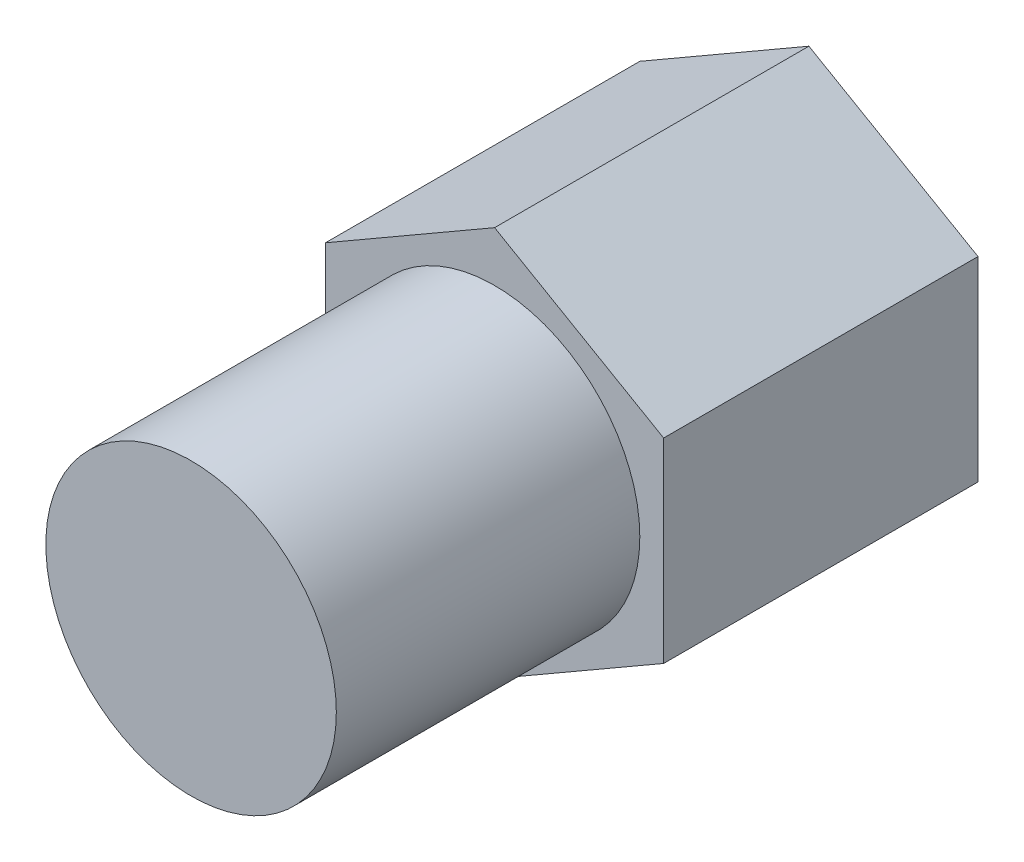
ISO-10303-21;
HEADER;
FILE_DESCRIPTION(('STEP AP214'),'2;1');
FILE_NAME('part.step','',(''),(''),'','','');
FILE_SCHEMA(('AUTOMOTIVE_DESIGN { 1 0 10303 214 1 1 1 1 }'));
ENDSEC;
DATA;
#1=APPLICATION_CONTEXT('core data for automotive mechanical design processes');
#2=APPLICATION_PROTOCOL_DEFINITION('international standard','automotive_design',2000,#1);
#3=PRODUCT_CONTEXT('',#1,'mechanical');
#4=PRODUCT('Part','Part','',(#3));
#5=PRODUCT_RELATED_PRODUCT_CATEGORY('part','',(#4));
#6=PRODUCT_DEFINITION_FORMATION('','',#4);
#7=PRODUCT_DEFINITION_CONTEXT('part definition',#1,'design');
#8=PRODUCT_DEFINITION('design','',#6,#7);
#9=PRODUCT_DEFINITION_SHAPE('','',#8);
#10=(LENGTH_UNIT() NAMED_UNIT(*) SI_UNIT(.MILLI.,.METRE.));
#11=(NAMED_UNIT(*) PLANE_ANGLE_UNIT() SI_UNIT($,.RADIAN.));
#12=(NAMED_UNIT(*) SI_UNIT($,.STERADIAN.) SOLID_ANGLE_UNIT());
#13=UNCERTAINTY_MEASURE_WITH_UNIT(LENGTH_MEASURE(1.E-05),#10,'distance_accuracy_value','');
#14=(GEOMETRIC_REPRESENTATION_CONTEXT(3) GLOBAL_UNCERTAINTY_ASSIGNED_CONTEXT((#13)) GLOBAL_UNIT_ASSIGNED_CONTEXT((#10,
#11,#12)) REPRESENTATION_CONTEXT('',''));
#15=CARTESIAN_POINT('',(0.,0.,0.));
#16=DIRECTION('',(0.,0.,1.));
#17=DIRECTION('',(1.,0.,0.));
#18=AXIS2_PLACEMENT_3D('',#15,#16,#17);
#19=CARTESIAN_POINT('',(7.8,4.50333209967908,14.5));
#20=DIRECTION('',(-0.5,-0.866025403784439,0.));
#21=DIRECTION('',(0.866025403784439,-0.5,0.));
#22=AXIS2_PLACEMENT_3D('',#19,#20,#21);
#23=PLANE('',#22);
#24=DIRECTION('',(-0.866025403784439,0.5,0.));
#25=VECTOR('',#24,1.);
#26=CARTESIAN_POINT('',(7.8,4.50333209967908,0.));
#27=LINE('',#26,#25);
#28=CARTESIAN_POINT('',(7.8,4.50333209967908,0.));
#29=VERTEX_POINT('',#28);
#30=CARTESIAN_POINT('',(0.,9.00666419935816,0.));
#31=VERTEX_POINT('',#30);
#32=EDGE_CURVE('E121',#29,#31,#27,.T.);
#33=ORIENTED_EDGE('',*,*,#32,.T.);
#34=DIRECTION('',(0.,0.,-1.));
#35=VECTOR('',#34,1.);
#36=CARTESIAN_POINT('',(0.,9.00666419935816,14.5));
#37=LINE('',#36,#35);
#38=CARTESIAN_POINT('',(0.,9.00666419935816,14.5));
#39=VERTEX_POINT('',#38);
#40=EDGE_CURVE('E45',#39,#31,#37,.T.);
#41=ORIENTED_EDGE('',*,*,#40,.F.);
#42=DIRECTION('',(-0.866025403784439,0.5,0.));
#43=VECTOR('',#42,1.);
#44=CARTESIAN_POINT('',(7.8,4.50333209967908,14.5));
#45=LINE('',#44,#43);
#46=CARTESIAN_POINT('',(7.8,4.50333209967908,14.5));
#47=VERTEX_POINT('',#46);
#48=EDGE_CURVE('E137',#47,#39,#45,.T.);
#49=ORIENTED_EDGE('',*,*,#48,.F.);
#50=DIRECTION('',(0.,0.,-1.));
#51=VECTOR('',#50,1.);
#52=CARTESIAN_POINT('',(7.8,4.50333209967908,14.5));
#53=LINE('',#52,#51);
#54=EDGE_CURVE('E122',#47,#29,#53,.T.);
#55=ORIENTED_EDGE('',*,*,#54,.T.);
#56=EDGE_LOOP('',(#33,#41,#49,#55));
#57=FACE_BOUND('',#56,.T.);
#58=ADVANCED_FACE('F39',(#57),#23,.F.);
#59=CARTESIAN_POINT('',(0.,9.00666419935816,14.5));
#60=DIRECTION('',(0.5,-0.866025403784439,0.));
#61=DIRECTION('',(0.866025403784439,0.5,0.));
#62=AXIS2_PLACEMENT_3D('',#59,#60,#61);
#63=PLANE('',#62);
#64=DIRECTION('',(-0.866025403784439,-0.5,0.));
#65=VECTOR('',#64,1.);
#66=CARTESIAN_POINT('',(0.,9.00666419935816,0.));
#67=LINE('',#66,#65);
#68=CARTESIAN_POINT('',(-7.8,4.50333209967908,0.));
#69=VERTEX_POINT('',#68);
#70=EDGE_CURVE('E126',#31,#69,#67,.T.);
#71=ORIENTED_EDGE('',*,*,#70,.T.);
#72=DIRECTION('',(0.,0.,-1.));
#73=VECTOR('',#72,1.);
#74=CARTESIAN_POINT('',(-7.8,4.50333209967908,14.5));
#75=LINE('',#74,#73);
#76=CARTESIAN_POINT('',(-7.8,4.50333209967908,14.5));
#77=VERTEX_POINT('',#76);
#78=EDGE_CURVE('E139',#77,#69,#75,.T.);
#79=ORIENTED_EDGE('',*,*,#78,.F.);
#80=DIRECTION('',(-0.866025403784439,-0.5,0.));
#81=VECTOR('',#80,1.);
#82=CARTESIAN_POINT('',(0.,9.00666419935816,14.5));
#83=LINE('',#82,#81);
#84=EDGE_CURVE('E94',#39,#77,#83,.T.);
#85=ORIENTED_EDGE('',*,*,#84,.F.);
#86=ORIENTED_EDGE('',*,*,#40,.T.);
#87=EDGE_LOOP('',(#71,#79,#85,#86));
#88=FACE_BOUND('',#87,.T.);
#89=ADVANCED_FACE('F145',(#88),#63,.F.);
#90=CARTESIAN_POINT('',(-7.8,4.50333209967908,14.5));
#91=DIRECTION('',(1.,0.,0.));
#92=DIRECTION('',(0.,1.,0.));
#93=AXIS2_PLACEMENT_3D('',#90,#91,#92);
#94=PLANE('',#93);
#95=DIRECTION('',(0.,-1.,0.));
#96=VECTOR('',#95,1.);
#97=CARTESIAN_POINT('',(-7.8,4.50333209967908,0.));
#98=LINE('',#97,#96);
#99=CARTESIAN_POINT('',(-7.8,-4.50333209967908,0.));
#100=VERTEX_POINT('',#99);
#101=EDGE_CURVE('E132',#69,#100,#98,.T.);
#102=ORIENTED_EDGE('',*,*,#101,.T.);
#103=DIRECTION('',(0.,0.,-1.));
#104=VECTOR('',#103,1.);
#105=CARTESIAN_POINT('',(-7.8,-4.50333209967908,14.5));
#106=LINE('',#105,#104);
#107=CARTESIAN_POINT('',(-7.8,-4.50333209967908,14.5));
#108=VERTEX_POINT('',#107);
#109=EDGE_CURVE('E117',#108,#100,#106,.T.);
#110=ORIENTED_EDGE('',*,*,#109,.F.);
#111=DIRECTION('',(0.,-1.,0.));
#112=VECTOR('',#111,1.);
#113=CARTESIAN_POINT('',(-7.8,4.50333209967908,14.5));
#114=LINE('',#113,#112);
#115=EDGE_CURVE('E110',#77,#108,#114,.T.);
#116=ORIENTED_EDGE('',*,*,#115,.F.);
#117=ORIENTED_EDGE('',*,*,#78,.T.);
#118=EDGE_LOOP('',(#102,#110,#116,#117));
#119=FACE_BOUND('',#118,.T.);
#120=ADVANCED_FACE('F147',(#119),#94,.F.);
#121=CARTESIAN_POINT('',(-7.8,-4.50333209967908,14.5));
#122=DIRECTION('',(0.5,0.866025403784439,0.));
#123=DIRECTION('',(-0.866025403784439,0.5,0.));
#124=AXIS2_PLACEMENT_3D('',#121,#122,#123);
#125=PLANE('',#124);
#126=DIRECTION('',(0.866025403784439,-0.5,0.));
#127=VECTOR('',#126,1.);
#128=CARTESIAN_POINT('',(-7.8,-4.50333209967908,0.));
#129=LINE('',#128,#127);
#130=CARTESIAN_POINT('',(0.,-9.00666419935816,0.));
#131=VERTEX_POINT('',#130);
#132=EDGE_CURVE('E113',#100,#131,#129,.T.);
#133=ORIENTED_EDGE('',*,*,#132,.T.);
#134=DIRECTION('',(0.,0.,-1.));
#135=VECTOR('',#134,1.);
#136=CARTESIAN_POINT('',(0.,-9.00666419935816,14.5));
#137=LINE('',#136,#135);
#138=CARTESIAN_POINT('',(0.,-9.00666419935816,14.5));
#139=VERTEX_POINT('',#138);
#140=EDGE_CURVE('E115',#139,#131,#137,.T.);
#141=ORIENTED_EDGE('',*,*,#140,.F.);
#142=DIRECTION('',(0.866025403784439,-0.5,0.));
#143=VECTOR('',#142,1.);
#144=CARTESIAN_POINT('',(-7.8,-4.50333209967908,14.5));
#145=LINE('',#144,#143);
#146=EDGE_CURVE('E101',#108,#139,#145,.T.);
#147=ORIENTED_EDGE('',*,*,#146,.F.);
#148=ORIENTED_EDGE('',*,*,#109,.T.);
#149=EDGE_LOOP('',(#133,#141,#147,#148));
#150=FACE_BOUND('',#149,.T.);
#151=ADVANCED_FACE('F114',(#150),#125,.F.);
#152=CARTESIAN_POINT('',(0.,-9.00666419935816,14.5));
#153=DIRECTION('',(-0.5,0.866025403784439,0.));
#154=DIRECTION('',(-0.866025403784439,-0.5,0.));
#155=AXIS2_PLACEMENT_3D('',#152,#153,#154);
#156=PLANE('',#155);
#157=DIRECTION('',(0.866025403784439,0.5,0.));
#158=VECTOR('',#157,1.);
#159=CARTESIAN_POINT('',(0.,-9.00666419935816,0.));
#160=LINE('',#159,#158);
#161=CARTESIAN_POINT('',(7.8,-4.50333209967908,0.));
#162=VERTEX_POINT('',#161);
#163=EDGE_CURVE('E76',#131,#162,#160,.T.);
#164=ORIENTED_EDGE('',*,*,#163,.T.);
#165=DIRECTION('',(0.,0.,-1.));
#166=VECTOR('',#165,1.);
#167=CARTESIAN_POINT('',(7.8,-4.50333209967908,14.5));
#168=LINE('',#167,#166);
#169=CARTESIAN_POINT('',(7.8,-4.50333209967908,14.5));
#170=VERTEX_POINT('',#169);
#171=EDGE_CURVE('E120',#170,#162,#168,.T.);
#172=ORIENTED_EDGE('',*,*,#171,.F.);
#173=DIRECTION('',(0.866025403784439,0.5,0.));
#174=VECTOR('',#173,1.);
#175=CARTESIAN_POINT('',(0.,-9.00666419935816,14.5));
#176=LINE('',#175,#174);
#177=EDGE_CURVE('E104',#139,#170,#176,.T.);
#178=ORIENTED_EDGE('',*,*,#177,.F.);
#179=ORIENTED_EDGE('',*,*,#140,.T.);
#180=EDGE_LOOP('',(#164,#172,#178,#179));
#181=FACE_BOUND('',#180,.T.);
#182=ADVANCED_FACE('F116',(#181),#156,.F.);
#183=CARTESIAN_POINT('',(7.8,-4.50333209967908,14.5));
#184=DIRECTION('',(-1.,0.,0.));
#185=DIRECTION('',(0.,0.,1.));
#186=AXIS2_PLACEMENT_3D('',#183,#184,#185);
#187=PLANE('',#186);
#188=DIRECTION('',(0.,1.,0.));
#189=VECTOR('',#188,1.);
#190=CARTESIAN_POINT('',(7.8,-4.50333209967908,0.));
#191=LINE('',#190,#189);
#192=EDGE_CURVE('E81',#162,#29,#191,.T.);
#193=ORIENTED_EDGE('',*,*,#192,.T.);
#194=ORIENTED_EDGE('',*,*,#54,.F.);
#195=DIRECTION('',(0.,1.,0.));
#196=VECTOR('',#195,1.);
#197=CARTESIAN_POINT('',(7.8,-4.50333209967908,14.5));
#198=LINE('',#197,#196);
#199=EDGE_CURVE('E57',#170,#47,#198,.T.);
#200=ORIENTED_EDGE('',*,*,#199,.F.);
#201=ORIENTED_EDGE('',*,*,#171,.T.);
#202=EDGE_LOOP('',(#193,#194,#200,#201));
#203=FACE_BOUND('',#202,.T.);
#204=ADVANCED_FACE('F167',(#203),#187,.F.);
#205=CARTESIAN_POINT('',(0.,0.,14.5));
#206=DIRECTION('',(0.,0.,1.));
#207=DIRECTION('',(1.,0.,0.));
#208=AXIS2_PLACEMENT_3D('',#205,#206,#207);
#209=PLANE('',#208);
#210=CARTESIAN_POINT('',(0.,0.,14.5));
#211=DIRECTION('',(0.,0.,1.));
#212=DIRECTION('',(1.,0.,0.));
#213=AXIS2_PLACEMENT_3D('',#210,#211,#212);
#214=CIRCLE('',#213,6.7);
#215=CARTESIAN_POINT('',(6.7,0.,14.5));
#216=VERTEX_POINT('',#215);
#217=EDGE_CURVE('E11',#216,#216,#214,.T.);
#218=ORIENTED_EDGE('',*,*,#217,.F.);
#219=EDGE_LOOP('',(#218));
#220=FACE_BOUND('',#219,.T.);
#221=ORIENTED_EDGE('',*,*,#48,.T.);
#222=ORIENTED_EDGE('',*,*,#84,.T.);
#223=ORIENTED_EDGE('',*,*,#115,.T.);
#224=ORIENTED_EDGE('',*,*,#146,.T.);
#225=ORIENTED_EDGE('',*,*,#177,.T.);
#226=ORIENTED_EDGE('',*,*,#199,.T.);
#227=EDGE_LOOP('',(#221,#222,#223,#224,#225,#226));
#228=FACE_BOUND('',#227,.T.);
#229=ADVANCED_FACE('F103',(#220,#228),#209,.T.);
#230=CARTESIAN_POINT('',(0.,0.,0.));
#231=DIRECTION('',(0.,0.,1.));
#232=DIRECTION('',(1.,0.,0.));
#233=AXIS2_PLACEMENT_3D('',#230,#231,#232);
#234=PLANE('',#233);
#235=ORIENTED_EDGE('',*,*,#32,.F.);
#236=ORIENTED_EDGE('',*,*,#192,.F.);
#237=ORIENTED_EDGE('',*,*,#163,.F.);
#238=ORIENTED_EDGE('',*,*,#132,.F.);
#239=ORIENTED_EDGE('',*,*,#101,.F.);
#240=ORIENTED_EDGE('',*,*,#70,.F.);
#241=EDGE_LOOP('',(#235,#236,#237,#238,#239,#240));
#242=FACE_BOUND('',#241,.T.);
#243=ADVANCED_FACE('F149',(#242),#234,.F.);
#244=CARTESIAN_POINT('',(0.,0.,28.5));
#245=DIRECTION('',(0.,0.,-1.));
#246=DIRECTION('',(-1.,0.,0.));
#247=AXIS2_PLACEMENT_3D('',#244,#245,#246);
#248=CYLINDRICAL_SURFACE('',#247,6.7);
#249=CARTESIAN_POINT('',(0.,0.,28.5));
#250=DIRECTION('',(0.,0.,1.));
#251=DIRECTION('',(1.,0.,0.));
#252=AXIS2_PLACEMENT_3D('',#249,#250,#251);
#253=CIRCLE('',#252,6.7);
#254=CARTESIAN_POINT('',(6.7,0.,28.5));
#255=VERTEX_POINT('',#254);
#256=EDGE_CURVE('E129',#255,#255,#253,.T.);
#257=ORIENTED_EDGE('',*,*,#256,.F.);
#258=EDGE_LOOP('',(#257));
#259=FACE_BOUND('',#258,.T.);
#260=ORIENTED_EDGE('',*,*,#217,.T.);
#261=EDGE_LOOP('',(#260));
#262=FACE_BOUND('',#261,.T.);
#263=ADVANCED_FACE('F157',(#259,#262),#248,.T.);
#264=CARTESIAN_POINT('',(0.,0.,28.5));
#265=DIRECTION('',(0.,0.,1.));
#266=DIRECTION('',(1.,0.,0.));
#267=AXIS2_PLACEMENT_3D('',#264,#265,#266);
#268=PLANE('',#267);
#269=ORIENTED_EDGE('',*,*,#256,.T.);
#270=EDGE_LOOP('',(#269));
#271=FACE_BOUND('',#270,.T.);
#272=ADVANCED_FACE('F160',(#271),#268,.T.);
#273=CLOSED_SHELL('',(#58,#89,#120,#151,#182,#204,#229,#243,#263,#272));
#274=MANIFOLD_SOLID_BREP('B2',#273);
#275=ADVANCED_BREP_SHAPE_REPRESENTATION('',(#18,#274),#14);
#276=SHAPE_DEFINITION_REPRESENTATION(#9,#275);
ENDSEC;
END-ISO-10303-21;
